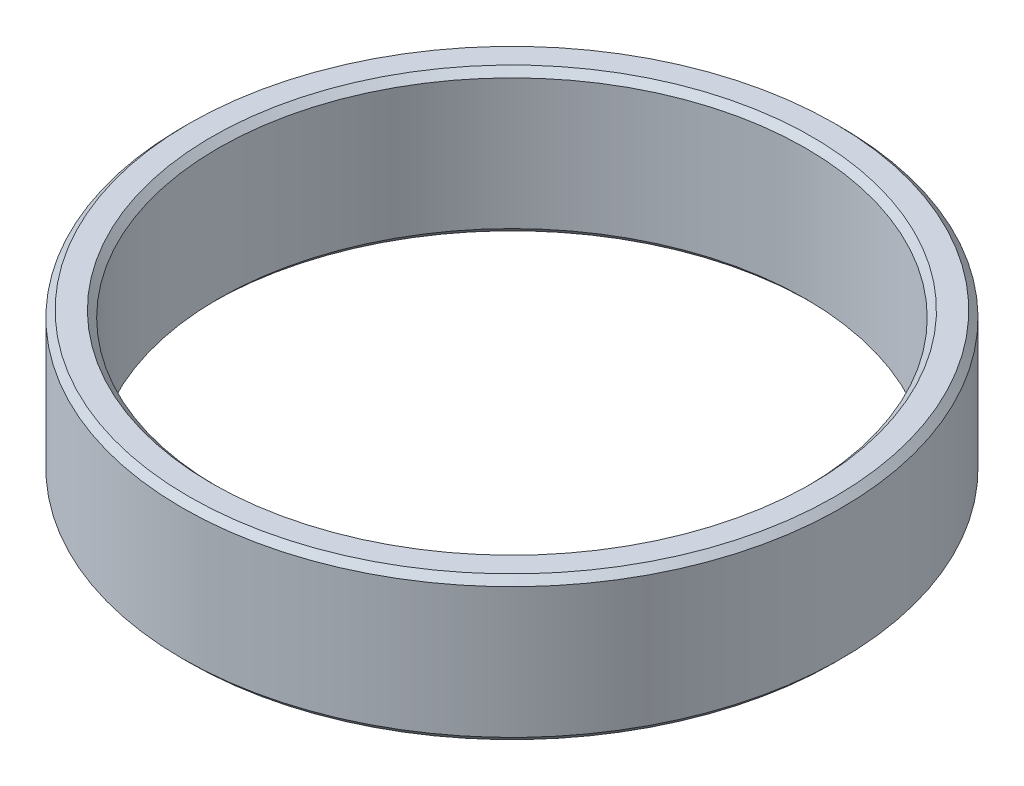
ISO-10303-21;
HEADER;
FILE_DESCRIPTION(('STEP AP214'),'2;1');
FILE_NAME('part.step','',(''),(''),'','','');
FILE_SCHEMA(('AUTOMOTIVE_DESIGN { 1 0 10303 214 1 1 1 1 }'));
ENDSEC;
DATA;
#1=APPLICATION_CONTEXT('core data for automotive mechanical design processes');
#2=APPLICATION_PROTOCOL_DEFINITION('international standard','automotive_design',2000,#1);
#3=PRODUCT_CONTEXT('',#1,'mechanical');
#4=PRODUCT('Part','Part','',(#3));
#5=PRODUCT_RELATED_PRODUCT_CATEGORY('part','',(#4));
#6=PRODUCT_DEFINITION_FORMATION('','',#4);
#7=PRODUCT_DEFINITION_CONTEXT('part definition',#1,'design');
#8=PRODUCT_DEFINITION('design','',#6,#7);
#9=PRODUCT_DEFINITION_SHAPE('','',#8);
#10=(LENGTH_UNIT() NAMED_UNIT(*) SI_UNIT(.MILLI.,.METRE.));
#11=(NAMED_UNIT(*) PLANE_ANGLE_UNIT() SI_UNIT($,.RADIAN.));
#12=(NAMED_UNIT(*) SI_UNIT($,.STERADIAN.) SOLID_ANGLE_UNIT());
#13=UNCERTAINTY_MEASURE_WITH_UNIT(LENGTH_MEASURE(1.E-05),#10,'distance_accuracy_value','');
#14=(GEOMETRIC_REPRESENTATION_CONTEXT(3) GLOBAL_UNCERTAINTY_ASSIGNED_CONTEXT((#13)) GLOBAL_UNIT_ASSIGNED_CONTEXT((#10,
#11,#12)) REPRESENTATION_CONTEXT('',''));
#15=CARTESIAN_POINT('',(0.,0.,0.));
#16=DIRECTION('',(0.,0.,1.));
#17=DIRECTION('',(1.,0.,0.));
#18=AXIS2_PLACEMENT_3D('',#15,#16,#17);
#19=CARTESIAN_POINT('',(0.,22.,0.));
#20=DIRECTION('',(0.,1.,0.));
#21=DIRECTION('',(0.,0.,1.));
#22=AXIS2_PLACEMENT_3D('',#19,#20,#21);
#23=PLANE('',#22);
#24=CARTESIAN_POINT('',(0.,22.,0.));
#25=DIRECTION('',(0.,1.,0.));
#26=DIRECTION('',(0.,0.,1.));
#27=AXIS2_PLACEMENT_3D('',#24,#25,#26);
#28=CIRCLE('',#27,46.);
#29=CARTESIAN_POINT('',(0.,22.,46.));
#30=VERTEX_POINT('',#29);
#31=EDGE_CURVE('E51',#30,#30,#28,.F.);
#32=ORIENTED_EDGE('',*,*,#31,.T.);
#33=EDGE_LOOP('',(#32));
#34=FACE_BOUND('',#33,.T.);
#35=CARTESIAN_POINT('',(0.,22.,0.));
#36=DIRECTION('',(0.,1.,0.));
#37=DIRECTION('',(0.,0.,1.));
#38=AXIS2_PLACEMENT_3D('',#35,#36,#37);
#39=CIRCLE('',#38,49.5);
#40=CARTESIAN_POINT('',(0.,22.,49.5));
#41=VERTEX_POINT('',#40);
#42=EDGE_CURVE('E55',#41,#41,#39,.T.);
#43=ORIENTED_EDGE('',*,*,#42,.T.);
#44=EDGE_LOOP('',(#43));
#45=FACE_BOUND('',#44,.T.);
#46=ADVANCED_FACE('F39',(#34,#45),#23,.T.);
#47=CARTESIAN_POINT('',(0.,0.,0.));
#48=DIRECTION('',(0.,1.,0.));
#49=DIRECTION('',(0.,0.,1.));
#50=AXIS2_PLACEMENT_3D('',#47,#48,#49);
#51=PLANE('',#50);
#52=CARTESIAN_POINT('',(0.,0.,0.));
#53=DIRECTION('',(0.,1.,0.));
#54=DIRECTION('',(0.,0.,1.));
#55=AXIS2_PLACEMENT_3D('',#52,#53,#54);
#56=CIRCLE('',#55,46.);
#57=CARTESIAN_POINT('',(0.,0.,46.));
#58=VERTEX_POINT('',#57);
#59=EDGE_CURVE('E66',#58,#58,#56,.T.);
#60=ORIENTED_EDGE('',*,*,#59,.T.);
#61=EDGE_LOOP('',(#60));
#62=FACE_BOUND('',#61,.T.);
#63=CARTESIAN_POINT('',(0.,0.,0.));
#64=DIRECTION('',(0.,1.,0.));
#65=DIRECTION('',(0.,0.,1.));
#66=AXIS2_PLACEMENT_3D('',#63,#64,#65);
#67=CIRCLE('',#66,49.5);
#68=CARTESIAN_POINT('',(0.,0.,49.5));
#69=VERTEX_POINT('',#68);
#70=EDGE_CURVE('E69',#69,#69,#67,.F.);
#71=ORIENTED_EDGE('',*,*,#70,.T.);
#72=EDGE_LOOP('',(#71));
#73=FACE_BOUND('',#72,.T.);
#74=ADVANCED_FACE('F73',(#62,#73),#51,.F.);
#75=CARTESIAN_POINT('',(0.,22.,0.));
#76=DIRECTION('',(0.,-1.,0.));
#77=DIRECTION('',(0.,0.,-1.));
#78=AXIS2_PLACEMENT_3D('',#75,#76,#77);
#79=CYLINDRICAL_SURFACE('',#78,50.5);
#80=CARTESIAN_POINT('',(0.,1.00000000000001,0.));
#81=DIRECTION('',(0.,1.,0.));
#82=DIRECTION('',(0.,0.,1.));
#83=AXIS2_PLACEMENT_3D('',#80,#81,#82);
#84=CIRCLE('',#83,50.5);
#85=CARTESIAN_POINT('',(0.,1.00000000000001,50.5));
#86=VERTEX_POINT('',#85);
#87=EDGE_CURVE('E10',#86,#86,#84,.T.);
#88=ORIENTED_EDGE('',*,*,#87,.T.);
#89=EDGE_LOOP('',(#88));
#90=FACE_BOUND('',#89,.T.);
#91=CARTESIAN_POINT('',(0.,21.,0.));
#92=DIRECTION('',(0.,1.,0.));
#93=DIRECTION('',(0.,0.,1.));
#94=AXIS2_PLACEMENT_3D('',#91,#92,#93);
#95=CIRCLE('',#94,50.5);
#96=CARTESIAN_POINT('',(0.,21.,50.5));
#97=VERTEX_POINT('',#96);
#98=EDGE_CURVE('E47',#97,#97,#95,.F.);
#99=ORIENTED_EDGE('',*,*,#98,.T.);
#100=EDGE_LOOP('',(#99));
#101=FACE_BOUND('',#100,.T.);
#102=ADVANCED_FACE('F94',(#90,#101),#79,.T.);
#103=CARTESIAN_POINT('',(0.,22.,0.));
#104=DIRECTION('',(0.,-1.,0.));
#105=DIRECTION('',(0.,0.,-1.));
#106=AXIS2_PLACEMENT_3D('',#103,#104,#105);
#107=CYLINDRICAL_SURFACE('',#106,45.);
#108=CARTESIAN_POINT('',(0.,1.00000000000001,0.));
#109=DIRECTION('',(0.,1.,0.));
#110=DIRECTION('',(0.,0.,1.));
#111=AXIS2_PLACEMENT_3D('',#108,#109,#110);
#112=CIRCLE('',#111,45.);
#113=CARTESIAN_POINT('',(0.,1.00000000000001,45.));
#114=VERTEX_POINT('',#113);
#115=EDGE_CURVE('E60',#114,#114,#112,.F.);
#116=ORIENTED_EDGE('',*,*,#115,.T.);
#117=EDGE_LOOP('',(#116));
#118=FACE_BOUND('',#117,.T.);
#119=CARTESIAN_POINT('',(0.,21.,0.));
#120=DIRECTION('',(0.,1.,0.));
#121=DIRECTION('',(0.,0.,1.));
#122=AXIS2_PLACEMENT_3D('',#119,#120,#121);
#123=CIRCLE('',#122,45.);
#124=CARTESIAN_POINT('',(0.,21.,45.));
#125=VERTEX_POINT('',#124);
#126=EDGE_CURVE('E63',#125,#125,#123,.T.);
#127=ORIENTED_EDGE('',*,*,#126,.T.);
#128=EDGE_LOOP('',(#127));
#129=FACE_BOUND('',#128,.T.);
#130=ADVANCED_FACE('F99',(#118,#129),#107,.F.);
#131=CARTESIAN_POINT('',(0.,0.,0.));
#132=DIRECTION('',(0.,-1.,0.));
#133=DIRECTION('',(0.,0.,-1.));
#134=AXIS2_PLACEMENT_3D('',#131,#132,#133);
#135=CONICAL_SURFACE('',#134,46.,0.785398163397445);
#136=ORIENTED_EDGE('',*,*,#115,.F.);
#137=EDGE_LOOP('',(#136));
#138=FACE_BOUND('',#137,.T.);
#139=ORIENTED_EDGE('',*,*,#59,.F.);
#140=EDGE_LOOP('',(#139));
#141=FACE_BOUND('',#140,.T.);
#142=ADVANCED_FACE('F84',(#138,#141),#135,.F.);
#143=CARTESIAN_POINT('',(0.,21.,0.));
#144=DIRECTION('',(0.,1.,0.));
#145=DIRECTION('',(0.,0.,1.));
#146=AXIS2_PLACEMENT_3D('',#143,#144,#145);
#147=CONICAL_SURFACE('',#146,45.,0.785398163397441);
#148=ORIENTED_EDGE('',*,*,#31,.F.);
#149=EDGE_LOOP('',(#148));
#150=FACE_BOUND('',#149,.T.);
#151=ORIENTED_EDGE('',*,*,#126,.F.);
#152=EDGE_LOOP('',(#151));
#153=FACE_BOUND('',#152,.T.);
#154=ADVANCED_FACE('F78',(#150,#153),#147,.F.);
#155=CARTESIAN_POINT('',(0.,1.00000000000001,0.));
#156=DIRECTION('',(0.,1.,0.));
#157=DIRECTION('',(0.,0.,1.));
#158=AXIS2_PLACEMENT_3D('',#155,#156,#157);
#159=CONICAL_SURFACE('',#158,50.5,0.785398163397448);
#160=ORIENTED_EDGE('',*,*,#70,.F.);
#161=EDGE_LOOP('',(#160));
#162=FACE_BOUND('',#161,.T.);
#163=ORIENTED_EDGE('',*,*,#87,.F.);
#164=EDGE_LOOP('',(#163));
#165=FACE_BOUND('',#164,.T.);
#166=ADVANCED_FACE('F75',(#162,#165),#159,.T.);
#167=CARTESIAN_POINT('',(0.,22.,0.));
#168=DIRECTION('',(0.,-1.,0.));
#169=DIRECTION('',(0.,0.,-1.));
#170=AXIS2_PLACEMENT_3D('',#167,#168,#169);
#171=CONICAL_SURFACE('',#170,49.5,0.785398163397441);
#172=ORIENTED_EDGE('',*,*,#98,.F.);
#173=EDGE_LOOP('',(#172));
#174=FACE_BOUND('',#173,.T.);
#175=ORIENTED_EDGE('',*,*,#42,.F.);
#176=EDGE_LOOP('',(#175));
#177=FACE_BOUND('',#176,.T.);
#178=ADVANCED_FACE('F42',(#174,#177),#171,.T.);
#179=CLOSED_SHELL('',(#46,#74,#102,#130,#142,#154,#166,#178));
#180=MANIFOLD_SOLID_BREP('B2',#179);
#181=ADVANCED_BREP_SHAPE_REPRESENTATION('',(#18,#180),#14);
#182=SHAPE_DEFINITION_REPRESENTATION(#9,#181);
ENDSEC;
END-ISO-10303-21;
